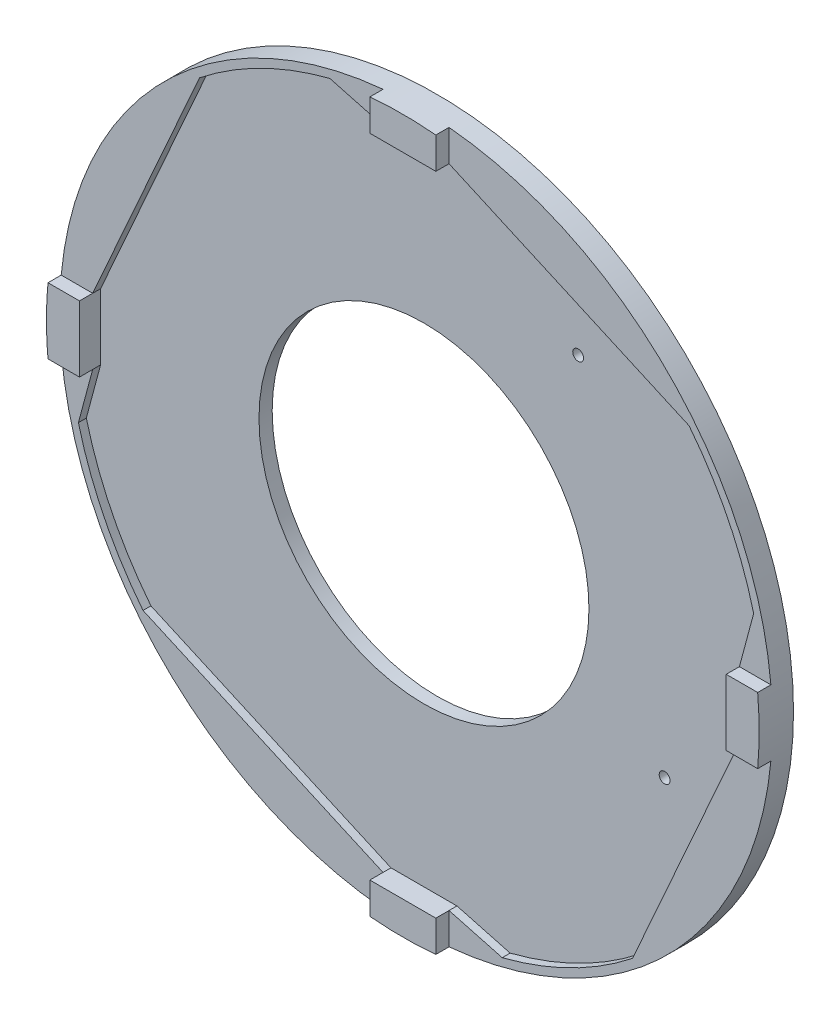
ISO-10303-21;
HEADER;
FILE_DESCRIPTION(('STEP AP214'),'2;1');
FILE_NAME('part.step','',(''),(''),'','','');
FILE_SCHEMA(('AUTOMOTIVE_DESIGN { 1 0 10303 214 1 1 1 1 }'));
ENDSEC;
DATA;
#1=APPLICATION_CONTEXT('core data for automotive mechanical design processes');
#2=APPLICATION_PROTOCOL_DEFINITION('international standard','automotive_design',2000,#1);
#3=PRODUCT_CONTEXT('',#1,'mechanical');
#4=PRODUCT('Part','Part','',(#3));
#5=PRODUCT_RELATED_PRODUCT_CATEGORY('part','',(#4));
#6=PRODUCT_DEFINITION_FORMATION('','',#4);
#7=PRODUCT_DEFINITION_CONTEXT('part definition',#1,'design');
#8=PRODUCT_DEFINITION('design','',#6,#7);
#9=PRODUCT_DEFINITION_SHAPE('','',#8);
#10=(LENGTH_UNIT() NAMED_UNIT(*) SI_UNIT(.MILLI.,.METRE.));
#11=(NAMED_UNIT(*) PLANE_ANGLE_UNIT() SI_UNIT($,.RADIAN.));
#12=(NAMED_UNIT(*) SI_UNIT($,.STERADIAN.) SOLID_ANGLE_UNIT());
#13=UNCERTAINTY_MEASURE_WITH_UNIT(LENGTH_MEASURE(1.E-05),#10,'distance_accuracy_value','');
#14=(GEOMETRIC_REPRESENTATION_CONTEXT(3) GLOBAL_UNCERTAINTY_ASSIGNED_CONTEXT((#13)) GLOBAL_UNIT_ASSIGNED_CONTEXT((#10,
#11,#12)) REPRESENTATION_CONTEXT('',''));
#15=CARTESIAN_POINT('',(0.,0.,0.));
#16=DIRECTION('',(0.,0.,1.));
#17=DIRECTION('',(1.,0.,0.));
#18=AXIS2_PLACEMENT_3D('',#15,#16,#17);
#19=CARTESIAN_POINT('',(134.420050587701,-12.4999999999986,8.));
#20=DIRECTION('',(0.,-1.,0.));
#21=DIRECTION('',(1.,0.,0.));
#22=AXIS2_PLACEMENT_3D('',#19,#20,#21);
#23=PLANE('',#22);
#24=DIRECTION('',(0.,0.,-1.));
#25=VECTOR('',#24,1.);
#26=CARTESIAN_POINT('',(122.5,-12.4999999999987,8.));
#27=LINE('',#26,#25);
#28=CARTESIAN_POINT('',(122.5,-12.4999999999987,8.));
#29=VERTEX_POINT('',#28);
#30=CARTESIAN_POINT('',(122.5,-12.4999999999987,3.));
#31=VERTEX_POINT('',#30);
#32=EDGE_CURVE('E328',#29,#31,#27,.T.);
#33=ORIENTED_EDGE('',*,*,#32,.T.);
#34=DIRECTION('',(1.,0.,0.));
#35=VECTOR('',#34,1.);
#36=CARTESIAN_POINT('',(1.3638792053156E-13,-12.5,3.));
#37=LINE('',#36,#35);
#38=CARTESIAN_POINT('',(134.420050587701,-12.4999999999986,3.));
#39=VERTEX_POINT('',#38);
#40=EDGE_CURVE('E340',#31,#39,#37,.T.);
#41=ORIENTED_EDGE('',*,*,#40,.T.);
#42=DIRECTION('',(0.,0.,-1.));
#43=VECTOR('',#42,1.);
#44=CARTESIAN_POINT('',(134.420050587701,-12.4999999999986,8.));
#45=LINE('',#44,#43);
#46=CARTESIAN_POINT('',(134.420050587701,-12.4999999999986,8.));
#47=VERTEX_POINT('',#46);
#48=EDGE_CURVE('E332',#47,#39,#45,.T.);
#49=ORIENTED_EDGE('',*,*,#48,.F.);
#50=DIRECTION('',(-1.,0.,0.));
#51=VECTOR('',#50,1.);
#52=CARTESIAN_POINT('',(134.420050587701,-12.4999999999986,8.));
#53=LINE('',#52,#51);
#54=EDGE_CURVE('E322',#47,#29,#53,.T.);
#55=ORIENTED_EDGE('',*,*,#54,.T.);
#56=EDGE_LOOP('',(#33,#41,#49,#55));
#57=FACE_BOUND('',#56,.T.);
#58=ADVANCED_FACE('F39',(#57),#23,.T.);
#59=CARTESIAN_POINT('',(134.420050587701,12.5000000000014,8.));
#60=DIRECTION('',(0.,1.,0.));
#61=DIRECTION('',(-1.,0.,0.));
#62=AXIS2_PLACEMENT_3D('',#59,#60,#61);
#63=PLANE('',#62);
#64=DIRECTION('',(-1.,0.,0.));
#65=VECTOR('',#64,1.);
#66=CARTESIAN_POINT('',(-1.3638792053156E-13,12.5,3.));
#67=LINE('',#66,#65);
#68=CARTESIAN_POINT('',(134.420050587701,12.5000000000014,3.));
#69=VERTEX_POINT('',#68);
#70=CARTESIAN_POINT('',(122.5,12.5000000000013,3.));
#71=VERTEX_POINT('',#70);
#72=EDGE_CURVE('E331',#69,#71,#67,.T.);
#73=ORIENTED_EDGE('',*,*,#72,.T.);
#74=DIRECTION('',(0.,0.,-1.));
#75=VECTOR('',#74,1.);
#76=CARTESIAN_POINT('',(122.5,12.5000000000013,8.));
#77=LINE('',#76,#75);
#78=CARTESIAN_POINT('',(122.5,12.5000000000013,8.));
#79=VERTEX_POINT('',#78);
#80=EDGE_CURVE('E325',#79,#71,#77,.T.);
#81=ORIENTED_EDGE('',*,*,#80,.F.);
#82=DIRECTION('',(1.,0.,0.));
#83=VECTOR('',#82,1.);
#84=CARTESIAN_POINT('',(134.420050587701,12.5000000000014,8.));
#85=LINE('',#84,#83);
#86=CARTESIAN_POINT('',(134.420050587701,12.5000000000014,8.));
#87=VERTEX_POINT('',#86);
#88=EDGE_CURVE('E316',#79,#87,#85,.T.);
#89=ORIENTED_EDGE('',*,*,#88,.T.);
#90=DIRECTION('',(0.,0.,-1.));
#91=VECTOR('',#90,1.);
#92=CARTESIAN_POINT('',(134.420050587701,12.5000000000014,8.));
#93=LINE('',#92,#91);
#94=EDGE_CURVE('E335',#87,#69,#93,.T.);
#95=ORIENTED_EDGE('',*,*,#94,.T.);
#96=EDGE_LOOP('',(#73,#81,#89,#95));
#97=FACE_BOUND('',#96,.T.);
#98=ADVANCED_FACE('F538',(#97),#63,.T.);
#99=CARTESIAN_POINT('',(-12.5,-134.420050587701,8.));
#100=DIRECTION('',(-1.,0.,0.));
#101=DIRECTION('',(0.,-1.,0.));
#102=AXIS2_PLACEMENT_3D('',#99,#100,#101);
#103=PLANE('',#102);
#104=DIRECTION('',(0.,0.,-1.));
#105=VECTOR('',#104,1.);
#106=CARTESIAN_POINT('',(-12.5,-122.5,8.));
#107=LINE('',#106,#105);
#108=CARTESIAN_POINT('',(-12.5,-122.5,8.));
#109=VERTEX_POINT('',#108);
#110=CARTESIAN_POINT('',(-12.5,-122.5,3.));
#111=VERTEX_POINT('',#110);
#112=EDGE_CURVE('E356',#109,#111,#107,.T.);
#113=ORIENTED_EDGE('',*,*,#112,.T.);
#114=DIRECTION('',(0.,-1.,0.));
#115=VECTOR('',#114,1.);
#116=CARTESIAN_POINT('',(-12.5,0.,3.));
#117=LINE('',#116,#115);
#118=CARTESIAN_POINT('',(-12.5,-134.420050587701,3.));
#119=VERTEX_POINT('',#118);
#120=EDGE_CURVE('E368',#111,#119,#117,.T.);
#121=ORIENTED_EDGE('',*,*,#120,.T.);
#122=DIRECTION('',(0.,0.,-1.));
#123=VECTOR('',#122,1.);
#124=CARTESIAN_POINT('',(-12.5,-134.420050587701,8.));
#125=LINE('',#124,#123);
#126=CARTESIAN_POINT('',(-12.5,-134.420050587701,8.));
#127=VERTEX_POINT('',#126);
#128=EDGE_CURVE('E360',#127,#119,#125,.T.);
#129=ORIENTED_EDGE('',*,*,#128,.F.);
#130=DIRECTION('',(0.,1.,0.));
#131=VECTOR('',#130,1.);
#132=CARTESIAN_POINT('',(-12.5,-134.420050587701,8.));
#133=LINE('',#132,#131);
#134=EDGE_CURVE('E351',#127,#109,#133,.T.);
#135=ORIENTED_EDGE('',*,*,#134,.T.);
#136=EDGE_LOOP('',(#113,#121,#129,#135));
#137=FACE_BOUND('',#136,.T.);
#138=ADVANCED_FACE('F477',(#137),#103,.T.);
#139=CARTESIAN_POINT('',(12.5,-134.420050587701,8.));
#140=DIRECTION('',(1.,0.,0.));
#141=DIRECTION('',(0.,1.,0.));
#142=AXIS2_PLACEMENT_3D('',#139,#140,#141);
#143=PLANE('',#142);
#144=DIRECTION('',(0.,1.,0.));
#145=VECTOR('',#144,1.);
#146=CARTESIAN_POINT('',(12.5,0.,3.));
#147=LINE('',#146,#145);
#148=CARTESIAN_POINT('',(12.5,-134.420050587701,3.));
#149=VERTEX_POINT('',#148);
#150=CARTESIAN_POINT('',(12.5,-122.5,3.));
#151=VERTEX_POINT('',#150);
#152=EDGE_CURVE('E359',#149,#151,#147,.T.);
#153=ORIENTED_EDGE('',*,*,#152,.T.);
#154=DIRECTION('',(0.,0.,-1.));
#155=VECTOR('',#154,1.);
#156=CARTESIAN_POINT('',(12.5,-122.5,8.));
#157=LINE('',#156,#155);
#158=CARTESIAN_POINT('',(12.5,-122.5,8.));
#159=VERTEX_POINT('',#158);
#160=EDGE_CURVE('E354',#159,#151,#157,.T.);
#161=ORIENTED_EDGE('',*,*,#160,.F.);
#162=DIRECTION('',(0.,-1.,0.));
#163=VECTOR('',#162,1.);
#164=CARTESIAN_POINT('',(12.5,-134.420050587701,8.));
#165=LINE('',#164,#163);
#166=CARTESIAN_POINT('',(12.5,-134.420050587701,8.));
#167=VERTEX_POINT('',#166);
#168=EDGE_CURVE('E345',#159,#167,#165,.T.);
#169=ORIENTED_EDGE('',*,*,#168,.T.);
#170=DIRECTION('',(0.,0.,-1.));
#171=VECTOR('',#170,1.);
#172=CARTESIAN_POINT('',(12.5,-134.420050587701,8.));
#173=LINE('',#172,#171);
#174=EDGE_CURVE('E363',#167,#149,#173,.T.);
#175=ORIENTED_EDGE('',*,*,#174,.T.);
#176=EDGE_LOOP('',(#153,#161,#169,#175));
#177=FACE_BOUND('',#176,.T.);
#178=ADVANCED_FACE('F484',(#177),#143,.T.);
#179=CARTESIAN_POINT('',(-134.420050587701,12.4999999999995,8.));
#180=DIRECTION('',(0.,1.,0.));
#181=DIRECTION('',(-1.,0.,0.));
#182=AXIS2_PLACEMENT_3D('',#179,#180,#181);
#183=PLANE('',#182);
#184=DIRECTION('',(0.,0.,-1.));
#185=VECTOR('',#184,1.);
#186=CARTESIAN_POINT('',(-122.5,12.4999999999996,8.));
#187=LINE('',#186,#185);
#188=CARTESIAN_POINT('',(-122.5,12.4999999999996,8.));
#189=VERTEX_POINT('',#188);
#190=CARTESIAN_POINT('',(-122.5,12.4999999999996,3.));
#191=VERTEX_POINT('',#190);
#192=EDGE_CURVE('E386',#189,#191,#187,.T.);
#193=ORIENTED_EDGE('',*,*,#192,.T.);
#194=DIRECTION('',(-1.,0.,0.));
#195=VECTOR('',#194,1.);
#196=CARTESIAN_POINT('',(0.,12.5,3.));
#197=LINE('',#196,#195);
#198=CARTESIAN_POINT('',(-134.420050587701,12.4999999999995,3.));
#199=VERTEX_POINT('',#198);
#200=EDGE_CURVE('E398',#191,#199,#197,.T.);
#201=ORIENTED_EDGE('',*,*,#200,.T.);
#202=DIRECTION('',(0.,0.,-1.));
#203=VECTOR('',#202,1.);
#204=CARTESIAN_POINT('',(-134.420050587701,12.4999999999995,8.));
#205=LINE('',#204,#203);
#206=CARTESIAN_POINT('',(-134.420050587701,12.4999999999995,8.));
#207=VERTEX_POINT('',#206);
#208=EDGE_CURVE('E390',#207,#199,#205,.T.);
#209=ORIENTED_EDGE('',*,*,#208,.F.);
#210=DIRECTION('',(1.,0.,0.));
#211=VECTOR('',#210,1.);
#212=CARTESIAN_POINT('',(-134.420050587701,12.4999999999995,8.));
#213=LINE('',#212,#211);
#214=EDGE_CURVE('E380',#207,#189,#213,.T.);
#215=ORIENTED_EDGE('',*,*,#214,.T.);
#216=EDGE_LOOP('',(#193,#201,#209,#215));
#217=FACE_BOUND('',#216,.T.);
#218=ADVANCED_FACE('F508',(#217),#183,.T.);
#219=CARTESIAN_POINT('',(-134.420050587701,-12.5000000000005,8.));
#220=DIRECTION('',(0.,-1.,0.));
#221=DIRECTION('',(1.,0.,0.));
#222=AXIS2_PLACEMENT_3D('',#219,#220,#221);
#223=PLANE('',#222);
#224=DIRECTION('',(1.,0.,0.));
#225=VECTOR('',#224,1.);
#226=CARTESIAN_POINT('',(0.,-12.5,3.));
#227=LINE('',#226,#225);
#228=CARTESIAN_POINT('',(-134.420050587701,-12.5000000000005,3.));
#229=VERTEX_POINT('',#228);
#230=CARTESIAN_POINT('',(-122.5,-12.5000000000004,3.));
#231=VERTEX_POINT('',#230);
#232=EDGE_CURVE('E389',#229,#231,#227,.T.);
#233=ORIENTED_EDGE('',*,*,#232,.T.);
#234=DIRECTION('',(0.,0.,-1.));
#235=VECTOR('',#234,1.);
#236=CARTESIAN_POINT('',(-122.5,-12.5000000000004,8.));
#237=LINE('',#236,#235);
#238=CARTESIAN_POINT('',(-122.5,-12.5000000000004,8.));
#239=VERTEX_POINT('',#238);
#240=EDGE_CURVE('E383',#239,#231,#237,.T.);
#241=ORIENTED_EDGE('',*,*,#240,.F.);
#242=DIRECTION('',(-1.,0.,0.));
#243=VECTOR('',#242,1.);
#244=CARTESIAN_POINT('',(-134.420050587701,-12.5000000000005,8.));
#245=LINE('',#244,#243);
#246=CARTESIAN_POINT('',(-134.420050587701,-12.5000000000005,8.));
#247=VERTEX_POINT('',#246);
#248=EDGE_CURVE('E374',#239,#247,#245,.T.);
#249=ORIENTED_EDGE('',*,*,#248,.T.);
#250=DIRECTION('',(0.,0.,-1.));
#251=VECTOR('',#250,1.);
#252=CARTESIAN_POINT('',(-134.420050587701,-12.5000000000005,8.));
#253=LINE('',#252,#251);
#254=EDGE_CURVE('E393',#247,#229,#253,.T.);
#255=ORIENTED_EDGE('',*,*,#254,.T.);
#256=EDGE_LOOP('',(#233,#241,#249,#255));
#257=FACE_BOUND('',#256,.T.);
#258=ADVANCED_FACE('F501',(#257),#223,.T.);
#259=CARTESIAN_POINT('',(12.5,134.420050587701,8.));
#260=DIRECTION('',(1.,0.,0.));
#261=DIRECTION('',(0.,1.,0.));
#262=AXIS2_PLACEMENT_3D('',#259,#260,#261);
#263=PLANE('',#262);
#264=DIRECTION('',(0.,0.,-1.));
#265=VECTOR('',#264,1.);
#266=CARTESIAN_POINT('',(12.5,122.5,8.));
#267=LINE('',#266,#265);
#268=CARTESIAN_POINT('',(12.5,122.5,8.));
#269=VERTEX_POINT('',#268);
#270=CARTESIAN_POINT('',(12.5,122.5,3.));
#271=VERTEX_POINT('',#270);
#272=EDGE_CURVE('E415',#269,#271,#267,.T.);
#273=ORIENTED_EDGE('',*,*,#272,.T.);
#274=DIRECTION('',(0.,1.,0.));
#275=VECTOR('',#274,1.);
#276=CARTESIAN_POINT('',(12.5,0.,3.));
#277=LINE('',#276,#275);
#278=CARTESIAN_POINT('',(12.5,134.420050587701,3.));
#279=VERTEX_POINT('',#278);
#280=EDGE_CURVE('E426',#271,#279,#277,.T.);
#281=ORIENTED_EDGE('',*,*,#280,.T.);
#282=DIRECTION('',(0.,0.,-1.));
#283=VECTOR('',#282,1.);
#284=CARTESIAN_POINT('',(12.5,134.420050587701,8.));
#285=LINE('',#284,#283);
#286=CARTESIAN_POINT('',(12.5,134.420050587701,8.));
#287=VERTEX_POINT('',#286);
#288=EDGE_CURVE('E419',#287,#279,#285,.T.);
#289=ORIENTED_EDGE('',*,*,#288,.F.);
#290=DIRECTION('',(0.,-1.,0.));
#291=VECTOR('',#290,1.);
#292=CARTESIAN_POINT('',(12.5,134.420050587701,8.));
#293=LINE('',#292,#291);
#294=EDGE_CURVE('E409',#287,#269,#293,.T.);
#295=ORIENTED_EDGE('',*,*,#294,.T.);
#296=EDGE_LOOP('',(#273,#281,#289,#295));
#297=FACE_BOUND('',#296,.T.);
#298=ADVANCED_FACE('F546',(#297),#263,.T.);
#299=CARTESIAN_POINT('',(-12.5,134.420050587701,8.));
#300=DIRECTION('',(-1.,0.,0.));
#301=DIRECTION('',(0.,-1.,0.));
#302=AXIS2_PLACEMENT_3D('',#299,#300,#301);
#303=PLANE('',#302);
#304=DIRECTION('',(0.,-1.,0.));
#305=VECTOR('',#304,1.);
#306=CARTESIAN_POINT('',(-12.5,0.,3.));
#307=LINE('',#306,#305);
#308=CARTESIAN_POINT('',(-12.5,134.420050587701,3.));
#309=VERTEX_POINT('',#308);
#310=CARTESIAN_POINT('',(-12.5,122.5,3.));
#311=VERTEX_POINT('',#310);
#312=EDGE_CURVE('E418',#309,#311,#307,.T.);
#313=ORIENTED_EDGE('',*,*,#312,.T.);
#314=DIRECTION('',(0.,0.,-1.));
#315=VECTOR('',#314,1.);
#316=CARTESIAN_POINT('',(-12.5,122.5,8.));
#317=LINE('',#316,#315);
#318=CARTESIAN_POINT('',(-12.5,122.5,8.));
#319=VERTEX_POINT('',#318);
#320=EDGE_CURVE('E412',#319,#311,#317,.T.);
#321=ORIENTED_EDGE('',*,*,#320,.F.);
#322=DIRECTION('',(0.,1.,0.));
#323=VECTOR('',#322,1.);
#324=CARTESIAN_POINT('',(-12.5,134.420050587701,8.));
#325=LINE('',#324,#323);
#326=CARTESIAN_POINT('',(-12.5,134.420050587701,8.));
#327=VERTEX_POINT('',#326);
#328=EDGE_CURVE('E404',#319,#327,#325,.T.);
#329=ORIENTED_EDGE('',*,*,#328,.T.);
#330=DIRECTION('',(0.,0.,-1.));
#331=VECTOR('',#330,1.);
#332=CARTESIAN_POINT('',(-12.5,134.420050587701,8.));
#333=LINE('',#332,#331);
#334=EDGE_CURVE('E62',#327,#309,#333,.T.);
#335=ORIENTED_EDGE('',*,*,#334,.T.);
#336=EDGE_LOOP('',(#313,#321,#329,#335));
#337=FACE_BOUND('',#336,.T.);
#338=ADVANCED_FACE('F515',(#337),#303,.T.);
#339=CARTESIAN_POINT('',(0.,0.,3.));
#340=DIRECTION('',(0.,0.,1.));
#341=DIRECTION('',(1.,0.,0.));
#342=AXIS2_PLACEMENT_3D('',#339,#340,#341);
#343=PLANE('',#342);
#344=ORIENTED_EDGE('',*,*,#40,.F.);
#345=DIRECTION('',(0.406736643075788,0.913545457642606,0.));
#346=VECTOR('',#345,1.);
#347=CARTESIAN_POINT('',(122.5,-12.4999999999987,3.));
#348=LINE('',#347,#346);
#349=CARTESIAN_POINT('',(82.0162986974361,-103.427881869315,3.));
#350=VERTEX_POINT('',#349);
#351=EDGE_CURVE('E448',#350,#31,#348,.T.);
#352=ORIENTED_EDGE('',*,*,#351,.F.);
#353=CARTESIAN_POINT('',(0.,0.,3.));
#354=DIRECTION('',(0.,0.,1.));
#355=DIRECTION('',(1.,0.,0.));
#356=AXIS2_PLACEMENT_3D('',#353,#354,#355);
#357=CIRCLE('',#356,132.);
#358=CARTESIAN_POINT('',(32.6483429391905,-127.898732219381,3.));
#359=VERTEX_POINT('',#358);
#360=EDGE_CURVE('E438',#359,#350,#357,.T.);
#361=ORIENTED_EDGE('',*,*,#360,.F.);
#362=DIRECTION('',(0.965925826289069,-0.258819045102517,0.));
#363=VECTOR('',#362,1.);
#364=CARTESIAN_POINT('',(12.5,-122.5,3.));
#365=LINE('',#364,#363);
#366=EDGE_CURVE('E245',#151,#359,#365,.T.);
#367=ORIENTED_EDGE('',*,*,#366,.F.);
#368=ORIENTED_EDGE('',*,*,#152,.F.);
#369=CARTESIAN_POINT('',(0.,0.,3.));
#370=DIRECTION('',(0.,0.,1.));
#371=DIRECTION('',(1.,0.,0.));
#372=AXIS2_PLACEMENT_3D('',#369,#370,#371);
#373=CIRCLE('',#372,135.);
#374=EDGE_CURVE('E486',#149,#39,#373,.T.);
#375=ORIENTED_EDGE('',*,*,#374,.T.);
#376=EDGE_LOOP('',(#344,#352,#361,#367,#368,#375));
#377=FACE_BOUND('',#376,.T.);
#378=ADVANCED_FACE('F445',(#377),#343,.T.);
#379=CARTESIAN_POINT('',(0.,0.,0.));
#380=DIRECTION('',(0.,0.,1.));
#381=DIRECTION('',(1.,0.,0.));
#382=AXIS2_PLACEMENT_3D('',#379,#380,#381);
#383=CYLINDRICAL_SURFACE('',#382,132.);
#384=ORIENTED_EDGE('',*,*,#360,.T.);
#385=DIRECTION('',(0.,0.,-1.));
#386=VECTOR('',#385,1.);
#387=CARTESIAN_POINT('',(82.0162986974361,-103.427881869315,3.));
#388=LINE('',#387,#386);
#389=CARTESIAN_POINT('',(82.0162986974361,-103.427881869315,0.));
#390=VERTEX_POINT('',#389);
#391=EDGE_CURVE('E232',#350,#390,#388,.T.);
#392=ORIENTED_EDGE('',*,*,#391,.T.);
#393=CARTESIAN_POINT('',(0.,0.,0.));
#394=DIRECTION('',(0.,0.,1.));
#395=DIRECTION('',(1.,0.,0.));
#396=AXIS2_PLACEMENT_3D('',#393,#394,#395);
#397=CIRCLE('',#396,132.);
#398=CARTESIAN_POINT('',(32.6483429391905,-127.898732219381,0.));
#399=VERTEX_POINT('',#398);
#400=EDGE_CURVE('E226',#399,#390,#397,.T.);
#401=ORIENTED_EDGE('',*,*,#400,.F.);
#402=DIRECTION('',(0.,0.,-1.));
#403=VECTOR('',#402,1.);
#404=CARTESIAN_POINT('',(32.6483429391905,-127.898732219381,3.));
#405=LINE('',#404,#403);
#406=EDGE_CURVE('E230',#359,#399,#405,.T.);
#407=ORIENTED_EDGE('',*,*,#406,.F.);
#408=EDGE_LOOP('',(#384,#392,#401,#407));
#409=FACE_BOUND('',#408,.T.);
#410=ADVANCED_FACE('F229',(#409),#383,.F.);
#411=ORIENTED_EDGE('',*,*,#120,.F.);
#412=DIRECTION('',(0.913545457642602,-0.406736643075798,0.));
#413=VECTOR('',#412,1.);
#414=CARTESIAN_POINT('',(-12.5,-122.5,3.));
#415=LINE('',#414,#413);
#416=CARTESIAN_POINT('',(-103.427881869316,-82.016298697435,3.));
#417=VERTEX_POINT('',#416);
#418=EDGE_CURVE('E247',#417,#111,#415,.T.);
#419=ORIENTED_EDGE('',*,*,#418,.F.);
#420=CARTESIAN_POINT('',(-127.898732219381,-32.6483429391909,3.));
#421=VERTEX_POINT('',#420);
#422=EDGE_CURVE('E432',#421,#417,#357,.T.);
#423=ORIENTED_EDGE('',*,*,#422,.F.);
#424=DIRECTION('',(-0.258819045102513,-0.96592582628907,0.));
#425=VECTOR('',#424,1.);
#426=CARTESIAN_POINT('',(-122.5,-12.5000000000004,3.));
#427=LINE('',#426,#425);
#428=EDGE_CURVE('E271',#231,#421,#427,.T.);
#429=ORIENTED_EDGE('',*,*,#428,.F.);
#430=ORIENTED_EDGE('',*,*,#232,.F.);
#431=EDGE_CURVE('E47',#229,#119,#373,.T.);
#432=ORIENTED_EDGE('',*,*,#431,.T.);
#433=EDGE_LOOP('',(#411,#419,#423,#429,#430,#432));
#434=FACE_BOUND('',#433,.T.);
#435=ADVANCED_FACE('F492',(#434),#343,.T.);
#436=ORIENTED_EDGE('',*,*,#422,.T.);
#437=DIRECTION('',(0.,0.,-1.));
#438=VECTOR('',#437,1.);
#439=CARTESIAN_POINT('',(-103.427881869316,-82.016298697435,3.));
#440=LINE('',#439,#438);
#441=CARTESIAN_POINT('',(-103.427881869316,-82.016298697435,0.));
#442=VERTEX_POINT('',#441);
#443=EDGE_CURVE('E246',#417,#442,#440,.T.);
#444=ORIENTED_EDGE('',*,*,#443,.T.);
#445=CARTESIAN_POINT('',(-127.898732219381,-32.6483429391909,0.));
#446=VERTEX_POINT('',#445);
#447=EDGE_CURVE('E236',#446,#442,#397,.T.);
#448=ORIENTED_EDGE('',*,*,#447,.F.);
#449=DIRECTION('',(0.,0.,-1.));
#450=VECTOR('',#449,1.);
#451=CARTESIAN_POINT('',(-127.898732219381,-32.6483429391909,3.));
#452=LINE('',#451,#450);
#453=EDGE_CURVE('E277',#421,#446,#452,.T.);
#454=ORIENTED_EDGE('',*,*,#453,.F.);
#455=EDGE_LOOP('',(#436,#444,#448,#454));
#456=FACE_BOUND('',#455,.T.);
#457=ADVANCED_FACE('F601',(#456),#383,.F.);
#458=ORIENTED_EDGE('',*,*,#200,.F.);
#459=DIRECTION('',(-0.406736643075795,-0.913545457642603,0.));
#460=VECTOR('',#459,1.);
#461=CARTESIAN_POINT('',(-122.5,12.4999999999996,3.));
#462=LINE('',#461,#460);
#463=CARTESIAN_POINT('',(-82.0162986974354,103.427881869315,3.));
#464=VERTEX_POINT('',#463);
#465=EDGE_CURVE('E273',#464,#191,#462,.T.);
#466=ORIENTED_EDGE('',*,*,#465,.F.);
#467=CARTESIAN_POINT('',(-32.6483429391905,127.898732219381,3.));
#468=VERTEX_POINT('',#467);
#469=EDGE_CURVE('E430',#468,#464,#357,.T.);
#470=ORIENTED_EDGE('',*,*,#469,.F.);
#471=DIRECTION('',(-0.965925826289069,0.258819045102517,0.));
#472=VECTOR('',#471,1.);
#473=CARTESIAN_POINT('',(-12.5,122.5,3.));
#474=LINE('',#473,#472);
#475=EDGE_CURVE('E292',#311,#468,#474,.T.);
#476=ORIENTED_EDGE('',*,*,#475,.F.);
#477=ORIENTED_EDGE('',*,*,#312,.F.);
#478=EDGE_CURVE('E11',#309,#199,#373,.T.);
#479=ORIENTED_EDGE('',*,*,#478,.T.);
#480=EDGE_LOOP('',(#458,#466,#470,#476,#477,#479));
#481=FACE_BOUND('',#480,.T.);
#482=ADVANCED_FACE('F511',(#481),#343,.T.);
#483=ORIENTED_EDGE('',*,*,#469,.T.);
#484=DIRECTION('',(0.,0.,-1.));
#485=VECTOR('',#484,1.);
#486=CARTESIAN_POINT('',(-82.0162986974354,103.427881869315,3.));
#487=LINE('',#486,#485);
#488=CARTESIAN_POINT('',(-82.0162986974354,103.427881869315,0.));
#489=VERTEX_POINT('',#488);
#490=EDGE_CURVE('E288',#464,#489,#487,.T.);
#491=ORIENTED_EDGE('',*,*,#490,.T.);
#492=CARTESIAN_POINT('',(-32.6483429391905,127.898732219381,0.));
#493=VERTEX_POINT('',#492);
#494=EDGE_CURVE('E428',#493,#489,#397,.T.);
#495=ORIENTED_EDGE('',*,*,#494,.F.);
#496=DIRECTION('',(0.,0.,-1.));
#497=VECTOR('',#496,1.);
#498=CARTESIAN_POINT('',(-32.6483429391905,127.898732219381,3.));
#499=LINE('',#498,#497);
#500=EDGE_CURVE('E298',#468,#493,#499,.T.);
#501=ORIENTED_EDGE('',*,*,#500,.F.);
#502=EDGE_LOOP('',(#483,#491,#495,#501));
#503=FACE_BOUND('',#502,.T.);
#504=ADVANCED_FACE('F594',(#503),#383,.F.);
#505=CARTESIAN_POINT('',(0.,0.,3.));
#506=DIRECTION('',(0.,0.,-1.));
#507=DIRECTION('',(-1.,0.,0.));
#508=AXIS2_PLACEMENT_3D('',#505,#506,#507);
#509=CYLINDRICAL_SURFACE('',#508,135.);
#510=ORIENTED_EDGE('',*,*,#48,.T.);
#511=ORIENTED_EDGE('',*,*,#374,.F.);
#512=ORIENTED_EDGE('',*,*,#174,.F.);
#513=CARTESIAN_POINT('',(0.,0.,8.));
#514=DIRECTION('',(0.,0.,-1.));
#515=DIRECTION('',(1.,0.,0.));
#516=AXIS2_PLACEMENT_3D('',#513,#514,#515);
#517=CIRCLE('',#516,135.);
#518=EDGE_CURVE('E348',#167,#127,#517,.T.);
#519=ORIENTED_EDGE('',*,*,#518,.T.);
#520=ORIENTED_EDGE('',*,*,#128,.T.);
#521=ORIENTED_EDGE('',*,*,#431,.F.);
#522=ORIENTED_EDGE('',*,*,#254,.F.);
#523=CARTESIAN_POINT('',(0.,0.,8.));
#524=DIRECTION('',(0.,0.,-1.));
#525=DIRECTION('',(0.,-1.,0.));
#526=AXIS2_PLACEMENT_3D('',#523,#524,#525);
#527=CIRCLE('',#526,135.);
#528=EDGE_CURVE('E377',#247,#207,#527,.T.);
#529=ORIENTED_EDGE('',*,*,#528,.T.);
#530=ORIENTED_EDGE('',*,*,#208,.T.);
#531=ORIENTED_EDGE('',*,*,#478,.F.);
#532=ORIENTED_EDGE('',*,*,#334,.F.);
#533=CARTESIAN_POINT('',(0.,0.,8.));
#534=DIRECTION('',(0.,0.,-1.));
#535=DIRECTION('',(-1.,0.,0.));
#536=AXIS2_PLACEMENT_3D('',#533,#534,#535);
#537=CIRCLE('',#536,135.);
#538=EDGE_CURVE('E406',#327,#287,#537,.T.);
#539=ORIENTED_EDGE('',*,*,#538,.T.);
#540=ORIENTED_EDGE('',*,*,#288,.T.);
#541=EDGE_CURVE('E48',#69,#279,#373,.T.);
#542=ORIENTED_EDGE('',*,*,#541,.F.);
#543=ORIENTED_EDGE('',*,*,#94,.F.);
#544=CARTESIAN_POINT('',(0.,0.,8.));
#545=DIRECTION('',(0.,0.,-1.));
#546=DIRECTION('',(0.,1.,0.));
#547=AXIS2_PLACEMENT_3D('',#544,#545,#546);
#548=CIRCLE('',#547,135.);
#549=EDGE_CURVE('E319',#87,#47,#548,.T.);
#550=ORIENTED_EDGE('',*,*,#549,.T.);
#551=EDGE_LOOP('',(#510,#511,#512,#519,#520,#521,#522,#529,#530,#531,#532,#539,#540,#542,#543,#550));
#552=FACE_BOUND('',#551,.T.);
#553=CARTESIAN_POINT('',(0.,0.,-5.));
#554=DIRECTION('',(0.,0.,-1.));
#555=DIRECTION('',(-1.,0.,0.));
#556=AXIS2_PLACEMENT_3D('',#553,#554,#555);
#557=CIRCLE('',#556,135.);
#558=CARTESIAN_POINT('',(-135.,0.,-5.));
#559=VERTEX_POINT('',#558);
#560=EDGE_CURVE('E463',#559,#559,#557,.T.);
#561=ORIENTED_EDGE('',*,*,#560,.F.);
#562=EDGE_LOOP('',(#561));
#563=FACE_BOUND('',#562,.T.);
#564=ADVANCED_FACE('F41',(#552,#563),#509,.T.);
#565=ORIENTED_EDGE('',*,*,#72,.F.);
#566=ORIENTED_EDGE('',*,*,#541,.T.);
#567=ORIENTED_EDGE('',*,*,#280,.F.);
#568=DIRECTION('',(-0.913545457642602,0.406736643075798,0.));
#569=VECTOR('',#568,1.);
#570=CARTESIAN_POINT('',(12.5,122.5,3.));
#571=LINE('',#570,#569);
#572=CARTESIAN_POINT('',(103.427881869316,82.016298697435,3.));
#573=VERTEX_POINT('',#572);
#574=EDGE_CURVE('E294',#573,#271,#571,.T.);
#575=ORIENTED_EDGE('',*,*,#574,.F.);
#576=CARTESIAN_POINT('',(127.898732219381,32.6483429391918,3.));
#577=VERTEX_POINT('',#576);
#578=EDGE_CURVE('E427',#577,#573,#357,.T.);
#579=ORIENTED_EDGE('',*,*,#578,.F.);
#580=DIRECTION('',(0.258819045102507,0.965925826289072,0.));
#581=VECTOR('',#580,1.);
#582=CARTESIAN_POINT('',(122.5,12.5000000000013,3.));
#583=LINE('',#582,#581);
#584=EDGE_CURVE('E453',#71,#577,#583,.T.);
#585=ORIENTED_EDGE('',*,*,#584,.F.);
#586=EDGE_LOOP('',(#565,#566,#567,#575,#579,#585));
#587=FACE_BOUND('',#586,.T.);
#588=ADVANCED_FACE('F543',(#587),#343,.T.);
#589=CARTESIAN_POINT('',(127.898732219381,32.6483429391918,0.));
#590=VERTEX_POINT('',#589);
#591=CARTESIAN_POINT('',(103.427881869316,82.016298697435,0.));
#592=VERTEX_POINT('',#591);
#593=EDGE_CURVE('E237',#590,#592,#397,.T.);
#594=ORIENTED_EDGE('',*,*,#593,.F.);
#595=DIRECTION('',(0.,0.,-1.));
#596=VECTOR('',#595,1.);
#597=CARTESIAN_POINT('',(127.898732219381,32.6483429391918,3.));
#598=LINE('',#597,#596);
#599=EDGE_CURVE('E452',#577,#590,#598,.T.);
#600=ORIENTED_EDGE('',*,*,#599,.F.);
#601=ORIENTED_EDGE('',*,*,#578,.T.);
#602=DIRECTION('',(0.,0.,-1.));
#603=VECTOR('',#602,1.);
#604=CARTESIAN_POINT('',(103.427881869316,82.016298697435,3.));
#605=LINE('',#604,#603);
#606=EDGE_CURVE('E309',#573,#592,#605,.T.);
#607=ORIENTED_EDGE('',*,*,#606,.T.);
#608=EDGE_LOOP('',(#594,#600,#601,#607));
#609=FACE_BOUND('',#608,.T.);
#610=ADVANCED_FACE('F527',(#609),#383,.F.);
#611=CARTESIAN_POINT('',(12.5,122.5,8.));
#612=DIRECTION('',(0.,-1.,0.));
#613=DIRECTION('',(0.,0.,-1.));
#614=AXIS2_PLACEMENT_3D('',#611,#612,#613);
#615=PLANE('',#614);
#616=DIRECTION('',(0.,0.,-1.));
#617=VECTOR('',#616,1.);
#618=CARTESIAN_POINT('',(12.5,122.5,3.));
#619=LINE('',#618,#617);
#620=CARTESIAN_POINT('',(12.5,122.5,0.));
#621=VERTEX_POINT('',#620);
#622=EDGE_CURVE('E307',#271,#621,#619,.T.);
#623=ORIENTED_EDGE('',*,*,#622,.F.);
#624=ORIENTED_EDGE('',*,*,#272,.F.);
#625=DIRECTION('',(-1.,0.,0.));
#626=VECTOR('',#625,1.);
#627=CARTESIAN_POINT('',(12.5,122.5,8.));
#628=LINE('',#627,#626);
#629=EDGE_CURVE('E401',#269,#319,#628,.T.);
#630=ORIENTED_EDGE('',*,*,#629,.T.);
#631=ORIENTED_EDGE('',*,*,#320,.T.);
#632=DIRECTION('',(0.,0.,-1.));
#633=VECTOR('',#632,1.);
#634=CARTESIAN_POINT('',(-12.5,122.5,3.));
#635=LINE('',#634,#633);
#636=CARTESIAN_POINT('',(-12.5,122.5,0.));
#637=VERTEX_POINT('',#636);
#638=EDGE_CURVE('E303',#311,#637,#635,.T.);
#639=ORIENTED_EDGE('',*,*,#638,.T.);
#640=DIRECTION('',(-1.,0.,0.));
#641=VECTOR('',#640,1.);
#642=CARTESIAN_POINT('',(12.5,122.5,0.));
#643=LINE('',#642,#641);
#644=EDGE_CURVE('E400',#621,#637,#643,.T.);
#645=ORIENTED_EDGE('',*,*,#644,.F.);
#646=EDGE_LOOP('',(#623,#624,#630,#631,#639,#645));
#647=FACE_BOUND('',#646,.T.);
#648=ADVANCED_FACE('F522',(#647),#615,.T.);
#649=CARTESIAN_POINT('',(0.,0.,8.));
#650=DIRECTION('',(0.,0.,-1.));
#651=DIRECTION('',(-1.,0.,0.));
#652=AXIS2_PLACEMENT_3D('',#649,#650,#651);
#653=PLANE('',#652);
#654=ORIENTED_EDGE('',*,*,#629,.F.);
#655=ORIENTED_EDGE('',*,*,#294,.F.);
#656=ORIENTED_EDGE('',*,*,#538,.F.);
#657=ORIENTED_EDGE('',*,*,#328,.F.);
#658=EDGE_LOOP('',(#654,#655,#656,#657));
#659=FACE_BOUND('',#658,.T.);
#660=ADVANCED_FACE('F550',(#659),#653,.F.);
#661=CARTESIAN_POINT('',(-122.5,12.4999999999996,8.));
#662=DIRECTION('',(1.,0.,0.));
#663=DIRECTION('',(0.,1.,0.));
#664=AXIS2_PLACEMENT_3D('',#661,#662,#663);
#665=PLANE('',#664);
#666=DIRECTION('',(0.,0.,-1.));
#667=VECTOR('',#666,1.);
#668=CARTESIAN_POINT('',(-122.5,12.4999999999996,3.));
#669=LINE('',#668,#667);
#670=CARTESIAN_POINT('',(-122.5,12.4999999999996,0.));
#671=VERTEX_POINT('',#670);
#672=EDGE_CURVE('E286',#191,#671,#669,.T.);
#673=ORIENTED_EDGE('',*,*,#672,.F.);
#674=ORIENTED_EDGE('',*,*,#192,.F.);
#675=DIRECTION('',(0.,-1.,0.));
#676=VECTOR('',#675,1.);
#677=CARTESIAN_POINT('',(-122.5,12.4999999999996,8.));
#678=LINE('',#677,#676);
#679=EDGE_CURVE('E371',#189,#239,#678,.T.);
#680=ORIENTED_EDGE('',*,*,#679,.T.);
#681=ORIENTED_EDGE('',*,*,#240,.T.);
#682=DIRECTION('',(0.,0.,-1.));
#683=VECTOR('',#682,1.);
#684=CARTESIAN_POINT('',(-122.5,-12.5000000000004,3.));
#685=LINE('',#684,#683);
#686=CARTESIAN_POINT('',(-122.5,-12.5000000000004,0.));
#687=VERTEX_POINT('',#686);
#688=EDGE_CURVE('E282',#231,#687,#685,.T.);
#689=ORIENTED_EDGE('',*,*,#688,.T.);
#690=DIRECTION('',(0.,-1.,0.));
#691=VECTOR('',#690,1.);
#692=CARTESIAN_POINT('',(-122.5,12.4999999999996,0.));
#693=LINE('',#692,#691);
#694=EDGE_CURVE('E370',#671,#687,#693,.T.);
#695=ORIENTED_EDGE('',*,*,#694,.F.);
#696=EDGE_LOOP('',(#673,#674,#680,#681,#689,#695));
#697=FACE_BOUND('',#696,.T.);
#698=ADVANCED_FACE('F505',(#697),#665,.T.);
#699=CARTESIAN_POINT('',(0.,0.,8.));
#700=DIRECTION('',(0.,0.,-1.));
#701=DIRECTION('',(0.,-1.,0.));
#702=AXIS2_PLACEMENT_3D('',#699,#700,#701);
#703=PLANE('',#702);
#704=ORIENTED_EDGE('',*,*,#679,.F.);
#705=ORIENTED_EDGE('',*,*,#214,.F.);
#706=ORIENTED_EDGE('',*,*,#528,.F.);
#707=ORIENTED_EDGE('',*,*,#248,.F.);
#708=EDGE_LOOP('',(#704,#705,#706,#707));
#709=FACE_BOUND('',#708,.T.);
#710=ADVANCED_FACE('F500',(#709),#703,.F.);
#711=CARTESIAN_POINT('',(-12.5,-122.5,8.));
#712=DIRECTION('',(0.,1.,0.));
#713=DIRECTION('',(0.,0.,1.));
#714=AXIS2_PLACEMENT_3D('',#711,#712,#713);
#715=PLANE('',#714);
#716=DIRECTION('',(0.,0.,-1.));
#717=VECTOR('',#716,1.);
#718=CARTESIAN_POINT('',(-12.5,-122.5,3.));
#719=LINE('',#718,#717);
#720=CARTESIAN_POINT('',(-12.5,-122.5,0.));
#721=VERTEX_POINT('',#720);
#722=EDGE_CURVE('E267',#111,#721,#719,.T.);
#723=ORIENTED_EDGE('',*,*,#722,.F.);
#724=ORIENTED_EDGE('',*,*,#112,.F.);
#725=DIRECTION('',(1.,0.,0.));
#726=VECTOR('',#725,1.);
#727=CARTESIAN_POINT('',(-12.5,-122.5,8.));
#728=LINE('',#727,#726);
#729=EDGE_CURVE('E342',#109,#159,#728,.T.);
#730=ORIENTED_EDGE('',*,*,#729,.T.);
#731=ORIENTED_EDGE('',*,*,#160,.T.);
#732=DIRECTION('',(0.,0.,-1.));
#733=VECTOR('',#732,1.);
#734=CARTESIAN_POINT('',(12.5,-122.5,3.));
#735=LINE('',#734,#733);
#736=CARTESIAN_POINT('',(12.5,-122.5,0.));
#737=VERTEX_POINT('',#736);
#738=EDGE_CURVE('E264',#151,#737,#735,.T.);
#739=ORIENTED_EDGE('',*,*,#738,.T.);
#740=DIRECTION('',(1.,0.,0.));
#741=VECTOR('',#740,1.);
#742=CARTESIAN_POINT('',(-12.5,-122.5,0.));
#743=LINE('',#742,#741);
#744=EDGE_CURVE('E253',#721,#737,#743,.T.);
#745=ORIENTED_EDGE('',*,*,#744,.F.);
#746=EDGE_LOOP('',(#723,#724,#730,#731,#739,#745));
#747=FACE_BOUND('',#746,.T.);
#748=ADVANCED_FACE('F474',(#747),#715,.T.);
#749=CARTESIAN_POINT('',(0.,0.,8.));
#750=DIRECTION('',(0.,0.,-1.));
#751=DIRECTION('',(1.,0.,0.));
#752=AXIS2_PLACEMENT_3D('',#749,#750,#751);
#753=PLANE('',#752);
#754=ORIENTED_EDGE('',*,*,#729,.F.);
#755=ORIENTED_EDGE('',*,*,#134,.F.);
#756=ORIENTED_EDGE('',*,*,#518,.F.);
#757=ORIENTED_EDGE('',*,*,#168,.F.);
#758=EDGE_LOOP('',(#754,#755,#756,#757));
#759=FACE_BOUND('',#758,.T.);
#760=ADVANCED_FACE('F481',(#759),#753,.F.);
#761=CARTESIAN_POINT('',(122.5,-12.4999999999987,8.));
#762=DIRECTION('',(-1.,0.,0.));
#763=DIRECTION('',(0.,-1.,0.));
#764=AXIS2_PLACEMENT_3D('',#761,#762,#763);
#765=PLANE('',#764);
#766=DIRECTION('',(0.,0.,-1.));
#767=VECTOR('',#766,1.);
#768=CARTESIAN_POINT('',(122.5,-12.4999999999987,3.));
#769=LINE('',#768,#767);
#770=CARTESIAN_POINT('',(122.5,-12.4999999999987,0.));
#771=VERTEX_POINT('',#770);
#772=EDGE_CURVE('E259',#31,#771,#769,.T.);
#773=ORIENTED_EDGE('',*,*,#772,.F.);
#774=ORIENTED_EDGE('',*,*,#32,.F.);
#775=DIRECTION('',(0.,1.,0.));
#776=VECTOR('',#775,1.);
#777=CARTESIAN_POINT('',(122.5,-12.4999999999987,8.));
#778=LINE('',#777,#776);
#779=EDGE_CURVE('E313',#29,#79,#778,.T.);
#780=ORIENTED_EDGE('',*,*,#779,.T.);
#781=ORIENTED_EDGE('',*,*,#80,.T.);
#782=DIRECTION('',(0.,0.,-1.));
#783=VECTOR('',#782,1.);
#784=CARTESIAN_POINT('',(122.5,12.5000000000013,3.));
#785=LINE('',#784,#783);
#786=CARTESIAN_POINT('',(122.5,12.5000000000013,0.));
#787=VERTEX_POINT('',#786);
#788=EDGE_CURVE('E255',#71,#787,#785,.T.);
#789=ORIENTED_EDGE('',*,*,#788,.T.);
#790=DIRECTION('',(0.,1.,0.));
#791=VECTOR('',#790,1.);
#792=CARTESIAN_POINT('',(122.5,-12.4999999999987,0.));
#793=LINE('',#792,#791);
#794=EDGE_CURVE('E306',#771,#787,#793,.T.);
#795=ORIENTED_EDGE('',*,*,#794,.F.);
#796=EDGE_LOOP('',(#773,#774,#780,#781,#789,#795));
#797=FACE_BOUND('',#796,.T.);
#798=ADVANCED_FACE('F534',(#797),#765,.T.);
#799=CARTESIAN_POINT('',(0.,0.,8.));
#800=DIRECTION('',(0.,0.,-1.));
#801=DIRECTION('',(0.,1.,0.));
#802=AXIS2_PLACEMENT_3D('',#799,#800,#801);
#803=PLANE('',#802);
#804=ORIENTED_EDGE('',*,*,#779,.F.);
#805=ORIENTED_EDGE('',*,*,#54,.F.);
#806=ORIENTED_EDGE('',*,*,#549,.F.);
#807=ORIENTED_EDGE('',*,*,#88,.F.);
#808=EDGE_LOOP('',(#804,#805,#806,#807));
#809=FACE_BOUND('',#808,.T.);
#810=ADVANCED_FACE('F541',(#809),#803,.F.);
#811=CARTESIAN_POINT('',(-12.5,122.5,3.));
#812=DIRECTION('',(-0.258819045102517,-0.965925826289069,0.));
#813=DIRECTION('',(0.965925826289069,-0.258819045102517,0.));
#814=AXIS2_PLACEMENT_3D('',#811,#812,#813);
#815=PLANE('',#814);
#816=DIRECTION('',(-0.965925826289069,0.258819045102517,0.));
#817=VECTOR('',#816,1.);
#818=CARTESIAN_POINT('',(-12.5,122.5,0.));
#819=LINE('',#818,#817);
#820=EDGE_CURVE('E285',#637,#493,#819,.T.);
#821=ORIENTED_EDGE('',*,*,#820,.F.);
#822=ORIENTED_EDGE('',*,*,#638,.F.);
#823=ORIENTED_EDGE('',*,*,#475,.T.);
#824=ORIENTED_EDGE('',*,*,#500,.T.);
#825=EDGE_LOOP('',(#821,#822,#823,#824));
#826=FACE_BOUND('',#825,.T.);
#827=ADVANCED_FACE('F518',(#826),#815,.T.);
#828=CARTESIAN_POINT('',(12.5,122.5,3.));
#829=DIRECTION('',(-0.406736643075798,-0.913545457642602,0.));
#830=DIRECTION('',(0.913545457642602,-0.406736643075798,0.));
#831=AXIS2_PLACEMENT_3D('',#828,#829,#830);
#832=PLANE('',#831);
#833=DIRECTION('',(-0.913545457642602,0.406736643075798,0.));
#834=VECTOR('',#833,1.);
#835=CARTESIAN_POINT('',(12.5,122.5,0.));
#836=LINE('',#835,#834);
#837=EDGE_CURVE('E295',#592,#621,#836,.T.);
#838=ORIENTED_EDGE('',*,*,#837,.F.);
#839=ORIENTED_EDGE('',*,*,#606,.F.);
#840=ORIENTED_EDGE('',*,*,#574,.T.);
#841=ORIENTED_EDGE('',*,*,#622,.T.);
#842=EDGE_LOOP('',(#838,#839,#840,#841));
#843=FACE_BOUND('',#842,.T.);
#844=ADVANCED_FACE('F525',(#843),#832,.T.);
#845=CARTESIAN_POINT('',(-122.5,-12.5000000000004,3.));
#846=DIRECTION('',(0.96592582628907,-0.258819045102513,0.));
#847=DIRECTION('',(0.258819045102513,0.96592582628907,0.));
#848=AXIS2_PLACEMENT_3D('',#845,#846,#847);
#849=PLANE('',#848);
#850=DIRECTION('',(-0.258819045102513,-0.96592582628907,0.));
#851=VECTOR('',#850,1.);
#852=CARTESIAN_POINT('',(-122.5,-12.5000000000004,0.));
#853=LINE('',#852,#851);
#854=EDGE_CURVE('E266',#687,#446,#853,.T.);
#855=ORIENTED_EDGE('',*,*,#854,.F.);
#856=ORIENTED_EDGE('',*,*,#688,.F.);
#857=ORIENTED_EDGE('',*,*,#428,.T.);
#858=ORIENTED_EDGE('',*,*,#453,.T.);
#859=EDGE_LOOP('',(#855,#856,#857,#858));
#860=FACE_BOUND('',#859,.T.);
#861=ADVANCED_FACE('F831',(#860),#849,.T.);
#862=CARTESIAN_POINT('',(-122.5,12.4999999999996,3.));
#863=DIRECTION('',(0.913545457642603,-0.406736643075794,0.));
#864=DIRECTION('',(0.406736643075795,0.913545457642604,0.));
#865=AXIS2_PLACEMENT_3D('',#862,#863,#864);
#866=PLANE('',#865);
#867=DIRECTION('',(-0.406736643075795,-0.913545457642603,0.));
#868=VECTOR('',#867,1.);
#869=CARTESIAN_POINT('',(-122.5,12.4999999999996,0.));
#870=LINE('',#869,#868);
#871=EDGE_CURVE('E274',#489,#671,#870,.T.);
#872=ORIENTED_EDGE('',*,*,#871,.F.);
#873=ORIENTED_EDGE('',*,*,#490,.F.);
#874=ORIENTED_EDGE('',*,*,#465,.T.);
#875=ORIENTED_EDGE('',*,*,#672,.T.);
#876=EDGE_LOOP('',(#872,#873,#874,#875));
#877=FACE_BOUND('',#876,.T.);
#878=ADVANCED_FACE('F852',(#877),#866,.T.);
#879=CARTESIAN_POINT('',(12.5,-122.5,3.));
#880=DIRECTION('',(0.258819045102517,0.965925826289069,0.));
#881=DIRECTION('',(-0.965925826289069,0.258819045102517,0.));
#882=AXIS2_PLACEMENT_3D('',#879,#880,#881);
#883=PLANE('',#882);
#884=DIRECTION('',(0.965925826289069,-0.258819045102517,0.));
#885=VECTOR('',#884,1.);
#886=CARTESIAN_POINT('',(12.5,-122.5,0.));
#887=LINE('',#886,#885);
#888=EDGE_CURVE('E242',#737,#399,#887,.T.);
#889=ORIENTED_EDGE('',*,*,#888,.F.);
#890=ORIENTED_EDGE('',*,*,#738,.F.);
#891=ORIENTED_EDGE('',*,*,#366,.T.);
#892=ORIENTED_EDGE('',*,*,#406,.T.);
#893=EDGE_LOOP('',(#889,#890,#891,#892));
#894=FACE_BOUND('',#893,.T.);
#895=ADVANCED_FACE('F240',(#894),#883,.T.);
#896=CARTESIAN_POINT('',(-12.5,-122.5,3.));
#897=DIRECTION('',(0.406736643075798,0.913545457642602,0.));
#898=DIRECTION('',(-0.913545457642602,0.406736643075798,0.));
#899=AXIS2_PLACEMENT_3D('',#896,#897,#898);
#900=PLANE('',#899);
#901=DIRECTION('',(0.913545457642602,-0.406736643075798,0.));
#902=VECTOR('',#901,1.);
#903=CARTESIAN_POINT('',(-12.5,-122.5,0.));
#904=LINE('',#903,#902);
#905=EDGE_CURVE('E254',#442,#721,#904,.T.);
#906=ORIENTED_EDGE('',*,*,#905,.F.);
#907=ORIENTED_EDGE('',*,*,#443,.F.);
#908=ORIENTED_EDGE('',*,*,#418,.T.);
#909=ORIENTED_EDGE('',*,*,#722,.T.);
#910=EDGE_LOOP('',(#906,#907,#908,#909));
#911=FACE_BOUND('',#910,.T.);
#912=ADVANCED_FACE('F470',(#911),#900,.T.);
#913=CARTESIAN_POINT('',(122.5,12.5000000000013,3.));
#914=DIRECTION('',(-0.965925826289072,0.258819045102507,0.));
#915=DIRECTION('',(-0.258819045102507,-0.965925826289072,0.));
#916=AXIS2_PLACEMENT_3D('',#913,#914,#915);
#917=PLANE('',#916);
#918=DIRECTION('',(0.258819045102507,0.965925826289072,0.));
#919=VECTOR('',#918,1.);
#920=CARTESIAN_POINT('',(122.5,12.5000000000013,0.));
#921=LINE('',#920,#919);
#922=EDGE_CURVE('E460',#787,#590,#921,.T.);
#923=ORIENTED_EDGE('',*,*,#922,.F.);
#924=ORIENTED_EDGE('',*,*,#788,.F.);
#925=ORIENTED_EDGE('',*,*,#584,.T.);
#926=ORIENTED_EDGE('',*,*,#599,.T.);
#927=EDGE_LOOP('',(#923,#924,#925,#926));
#928=FACE_BOUND('',#927,.T.);
#929=ADVANCED_FACE('F531',(#928),#917,.T.);
#930=CARTESIAN_POINT('',(122.5,-12.4999999999987,3.));
#931=DIRECTION('',(-0.913545457642606,0.406736643075788,0.));
#932=DIRECTION('',(-0.406736643075788,-0.913545457642606,0.));
#933=AXIS2_PLACEMENT_3D('',#930,#931,#932);
#934=PLANE('',#933);
#935=DIRECTION('',(0.406736643075788,0.913545457642606,0.));
#936=VECTOR('',#935,1.);
#937=CARTESIAN_POINT('',(122.5,-12.4999999999987,0.));
#938=LINE('',#937,#936);
#939=EDGE_CURVE('E456',#390,#771,#938,.T.);
#940=ORIENTED_EDGE('',*,*,#939,.F.);
#941=ORIENTED_EDGE('',*,*,#391,.F.);
#942=ORIENTED_EDGE('',*,*,#351,.T.);
#943=ORIENTED_EDGE('',*,*,#772,.T.);
#944=EDGE_LOOP('',(#940,#941,#942,#943));
#945=FACE_BOUND('',#944,.T.);
#946=ADVANCED_FACE('F888',(#945),#934,.T.);
#947=CARTESIAN_POINT('',(0.,0.,0.));
#948=DIRECTION('',(0.,0.,-1.));
#949=DIRECTION('',(-1.,0.,0.));
#950=AXIS2_PLACEMENT_3D('',#947,#948,#949);
#951=PLANE('',#950);
#952=CARTESIAN_POINT('',(91.1684396980705,-41.0891178174864,0.));
#953=DIRECTION('',(0.,0.,-1.));
#954=DIRECTION('',(-1.,0.,0.));
#955=AXIS2_PLACEMENT_3D('',#952,#953,#954);
#956=CIRCLE('',#955,2.04999999999999);
#957=CARTESIAN_POINT('',(89.1184396980705,-41.0891178174864,0.));
#958=VERTEX_POINT('',#957);
#959=EDGE_CURVE('E985',#958,#958,#956,.T.);
#960=ORIENTED_EDGE('',*,*,#959,.T.);
#961=EDGE_LOOP('',(#960));
#962=FACE_BOUND('',#961,.T.);
#963=CARTESIAN_POINT('',(58.4096258931752,81.1684396980706,0.));
#964=DIRECTION('',(0.,0.,-1.));
#965=DIRECTION('',(-1.,0.,0.));
#966=AXIS2_PLACEMENT_3D('',#963,#964,#965);
#967=CIRCLE('',#966,2.04999999999999);
#968=CARTESIAN_POINT('',(56.3596258931752,81.1684396980706,0.));
#969=VERTEX_POINT('',#968);
#970=EDGE_CURVE('E987',#969,#969,#967,.T.);
#971=ORIENTED_EDGE('',*,*,#970,.T.);
#972=EDGE_LOOP('',(#971));
#973=FACE_BOUND('',#972,.T.);
#974=CARTESIAN_POINT('',(0.,0.,0.));
#975=DIRECTION('',(0.,0.,-1.));
#976=DIRECTION('',(-1.,0.,0.));
#977=AXIS2_PLACEMENT_3D('',#974,#975,#976);
#978=CIRCLE('',#977,62.5);
#979=CARTESIAN_POINT('',(-62.5,0.,0.));
#980=VERTEX_POINT('',#979);
#981=EDGE_CURVE('E990',#980,#980,#978,.T.);
#982=ORIENTED_EDGE('',*,*,#981,.T.);
#983=EDGE_LOOP('',(#982));
#984=FACE_BOUND('',#983,.T.);
#985=ORIENTED_EDGE('',*,*,#888,.T.);
#986=ORIENTED_EDGE('',*,*,#400,.T.);
#987=ORIENTED_EDGE('',*,*,#939,.T.);
#988=ORIENTED_EDGE('',*,*,#794,.T.);
#989=ORIENTED_EDGE('',*,*,#922,.T.);
#990=ORIENTED_EDGE('',*,*,#593,.T.);
#991=ORIENTED_EDGE('',*,*,#837,.T.);
#992=ORIENTED_EDGE('',*,*,#644,.T.);
#993=ORIENTED_EDGE('',*,*,#820,.T.);
#994=ORIENTED_EDGE('',*,*,#494,.T.);
#995=ORIENTED_EDGE('',*,*,#871,.T.);
#996=ORIENTED_EDGE('',*,*,#694,.T.);
#997=ORIENTED_EDGE('',*,*,#854,.T.);
#998=ORIENTED_EDGE('',*,*,#447,.T.);
#999=ORIENTED_EDGE('',*,*,#905,.T.);
#1000=ORIENTED_EDGE('',*,*,#744,.T.);
#1001=EDGE_LOOP('',(#985,#986,#987,#988,#989,#990,#991,#992,#993,#994,#995,#996,#997,#998,#999,#1000));
#1002=FACE_BOUND('',#1001,.T.);
#1003=ADVANCED_FACE('F250',(#962,#973,#984,#1002),#951,.F.);
#1004=CARTESIAN_POINT('',(0.,0.,-5.));
#1005=DIRECTION('',(0.,0.,-1.));
#1006=DIRECTION('',(-1.,0.,0.));
#1007=AXIS2_PLACEMENT_3D('',#1004,#1005,#1006);
#1008=PLANE('',#1007);
#1009=CARTESIAN_POINT('',(91.1684396980705,-41.0891178174864,-5.));
#1010=DIRECTION('',(0.,0.,-1.));
#1011=DIRECTION('',(-1.,0.,0.));
#1012=AXIS2_PLACEMENT_3D('',#1009,#1010,#1011);
#1013=CIRCLE('',#1012,2.04999999999999);
#1014=CARTESIAN_POINT('',(89.1184396980705,-41.0891178174864,-5.));
#1015=VERTEX_POINT('',#1014);
#1016=EDGE_CURVE('E982',#1015,#1015,#1013,.T.);
#1017=ORIENTED_EDGE('',*,*,#1016,.F.);
#1018=EDGE_LOOP('',(#1017));
#1019=FACE_BOUND('',#1018,.T.);
#1020=CARTESIAN_POINT('',(58.4096258931752,81.1684396980706,-5.));
#1021=DIRECTION('',(0.,0.,-1.));
#1022=DIRECTION('',(-1.,0.,0.));
#1023=AXIS2_PLACEMENT_3D('',#1020,#1021,#1022);
#1024=CIRCLE('',#1023,2.04999999999999);
#1025=CARTESIAN_POINT('',(56.3596258931752,81.1684396980706,-5.));
#1026=VERTEX_POINT('',#1025);
#1027=EDGE_CURVE('E1003',#1026,#1026,#1024,.T.);
#1028=ORIENTED_EDGE('',*,*,#1027,.F.);
#1029=EDGE_LOOP('',(#1028));
#1030=FACE_BOUND('',#1029,.T.);
#1031=CARTESIAN_POINT('',(0.,0.,-5.));
#1032=DIRECTION('',(0.,0.,-1.));
#1033=DIRECTION('',(-1.,0.,0.));
#1034=AXIS2_PLACEMENT_3D('',#1031,#1032,#1033);
#1035=CIRCLE('',#1034,62.5);
#1036=CARTESIAN_POINT('',(-62.5,0.,-5.));
#1037=VERTEX_POINT('',#1036);
#1038=EDGE_CURVE('E986',#1037,#1037,#1035,.T.);
#1039=ORIENTED_EDGE('',*,*,#1038,.F.);
#1040=EDGE_LOOP('',(#1039));
#1041=FACE_BOUND('',#1040,.T.);
#1042=ORIENTED_EDGE('',*,*,#560,.T.);
#1043=EDGE_LOOP('',(#1042));
#1044=FACE_BOUND('',#1043,.T.);
#1045=ADVANCED_FACE('F906',(#1019,#1030,#1041,#1044),#1008,.T.);
#1046=CARTESIAN_POINT('',(0.,0.,5.));
#1047=DIRECTION('',(0.,0.,-1.));
#1048=DIRECTION('',(-1.,0.,0.));
#1049=AXIS2_PLACEMENT_3D('',#1046,#1047,#1048);
#1050=CYLINDRICAL_SURFACE('',#1049,62.5);
#1051=ORIENTED_EDGE('',*,*,#1038,.T.);
#1052=EDGE_LOOP('',(#1051));
#1053=FACE_BOUND('',#1052,.T.);
#1054=ORIENTED_EDGE('',*,*,#981,.F.);
#1055=EDGE_LOOP('',(#1054));
#1056=FACE_BOUND('',#1055,.T.);
#1057=ADVANCED_FACE('F900',(#1053,#1056),#1050,.F.);
#1058=CARTESIAN_POINT('',(58.4096258931752,81.1684396980706,5.));
#1059=DIRECTION('',(0.,0.,-1.));
#1060=DIRECTION('',(-1.,0.,0.));
#1061=AXIS2_PLACEMENT_3D('',#1058,#1059,#1060);
#1062=CYLINDRICAL_SURFACE('',#1061,2.04999999999999);
#1063=ORIENTED_EDGE('',*,*,#1027,.T.);
#1064=EDGE_LOOP('',(#1063));
#1065=FACE_BOUND('',#1064,.T.);
#1066=ORIENTED_EDGE('',*,*,#970,.F.);
#1067=EDGE_LOOP('',(#1066));
#1068=FACE_BOUND('',#1067,.T.);
#1069=ADVANCED_FACE('F905',(#1065,#1068),#1062,.F.);
#1070=CARTESIAN_POINT('',(91.1684396980705,-41.0891178174864,5.));
#1071=DIRECTION('',(0.,0.,-1.));
#1072=DIRECTION('',(-1.,0.,0.));
#1073=AXIS2_PLACEMENT_3D('',#1070,#1071,#1072);
#1074=CYLINDRICAL_SURFACE('',#1073,2.04999999999999);
#1075=ORIENTED_EDGE('',*,*,#1016,.T.);
#1076=EDGE_LOOP('',(#1075));
#1077=FACE_BOUND('',#1076,.T.);
#1078=ORIENTED_EDGE('',*,*,#959,.F.);
#1079=EDGE_LOOP('',(#1078));
#1080=FACE_BOUND('',#1079,.T.);
#1081=ADVANCED_FACE('F935',(#1077,#1080),#1074,.F.);
#1082=CLOSED_SHELL('',(#58,#98,#138,#178,#218,#258,#298,#338,#378,#410,#435,#457,#482,#504,#564,
#588,#610,#648,#660,#698,#710,#748,#760,#798,#810,#827,#844,#861,#878,#895,#912,#929,#946,#1003,
#1045,#1057,#1069,#1081));
#1083=MANIFOLD_SOLID_BREP('B2',#1082);
#1084=ADVANCED_BREP_SHAPE_REPRESENTATION('',(#18,#1083),#14);
#1085=SHAPE_DEFINITION_REPRESENTATION(#9,#1084);
ENDSEC;
END-ISO-10303-21;
